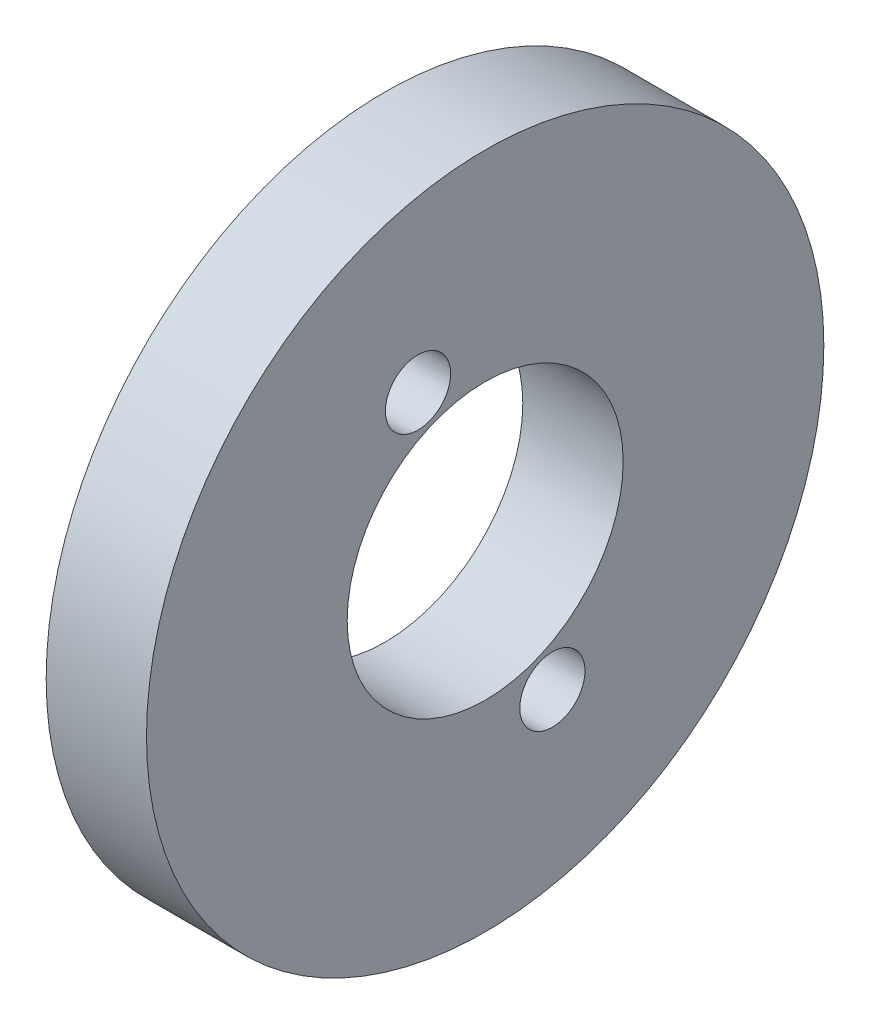
ISO-10303-21;
HEADER;
FILE_DESCRIPTION(('STEP AP214'),'2;1');
FILE_NAME('part.step','',(''),(''),'','','');
FILE_SCHEMA(('AUTOMOTIVE_DESIGN { 1 0 10303 214 1 1 1 1 }'));
ENDSEC;
DATA;
#1=APPLICATION_CONTEXT('core data for automotive mechanical design processes');
#2=APPLICATION_PROTOCOL_DEFINITION('international standard','automotive_design',2000,#1);
#3=PRODUCT_CONTEXT('',#1,'mechanical');
#4=PRODUCT('Part','Part','',(#3));
#5=PRODUCT_RELATED_PRODUCT_CATEGORY('part','',(#4));
#6=PRODUCT_DEFINITION_FORMATION('','',#4);
#7=PRODUCT_DEFINITION_CONTEXT('part definition',#1,'design');
#8=PRODUCT_DEFINITION('design','',#6,#7);
#9=PRODUCT_DEFINITION_SHAPE('','',#8);
#10=(LENGTH_UNIT() NAMED_UNIT(*) SI_UNIT(.MILLI.,.METRE.));
#11=(NAMED_UNIT(*) PLANE_ANGLE_UNIT() SI_UNIT($,.RADIAN.));
#12=(NAMED_UNIT(*) SI_UNIT($,.STERADIAN.) SOLID_ANGLE_UNIT());
#13=UNCERTAINTY_MEASURE_WITH_UNIT(LENGTH_MEASURE(1.E-05),#10,'distance_accuracy_value','');
#14=(GEOMETRIC_REPRESENTATION_CONTEXT(3) GLOBAL_UNCERTAINTY_ASSIGNED_CONTEXT((#13)) GLOBAL_UNIT_ASSIGNED_CONTEXT((#10,
#11,#12)) REPRESENTATION_CONTEXT('',''));
#15=CARTESIAN_POINT('',(0.,0.,0.));
#16=DIRECTION('',(0.,0.,1.));
#17=DIRECTION('',(1.,0.,0.));
#18=AXIS2_PLACEMENT_3D('',#15,#16,#17);
#19=CARTESIAN_POINT('',(135.7,27.,0.));
#20=DIRECTION('',(1.,0.,0.));
#21=DIRECTION('',(0.,0.,-1.));
#22=AXIS2_PLACEMENT_3D('',#19,#20,#21);
#23=PLANE('',#22);
#24=CARTESIAN_POINT('',(135.7,12.934313455158,5.35756805311126));
#25=DIRECTION('',(1.,0.,0.));
#26=DIRECTION('',(0.,0.,-1.));
#27=AXIS2_PLACEMENT_3D('',#24,#25,#26);
#28=CIRCLE('',#27,2.6);
#29=CARTESIAN_POINT('',(135.7,12.934313455158,2.75756805311126));
#30=VERTEX_POINT('',#29);
#31=EDGE_CURVE('E60',#30,#30,#28,.F.);
#32=ORIENTED_EDGE('',*,*,#31,.F.);
#33=EDGE_LOOP('',(#32));
#34=FACE_BOUND('',#33,.T.);
#35=CARTESIAN_POINT('',(135.7,-12.934313455158,-5.35756805311126));
#36=DIRECTION('',(1.,0.,0.));
#37=DIRECTION('',(0.,0.,-1.));
#38=AXIS2_PLACEMENT_3D('',#35,#36,#37);
#39=CIRCLE('',#38,2.6);
#40=CARTESIAN_POINT('',(135.7,-12.934313455158,-7.95756805311126));
#41=VERTEX_POINT('',#40);
#42=EDGE_CURVE('E64',#41,#41,#39,.F.);
#43=ORIENTED_EDGE('',*,*,#42,.F.);
#44=EDGE_LOOP('',(#43));
#45=FACE_BOUND('',#44,.T.);
#46=CARTESIAN_POINT('',(135.7,0.,0.));
#47=DIRECTION('',(-1.,0.,0.));
#48=DIRECTION('',(0.,0.,1.));
#49=AXIS2_PLACEMENT_3D('',#46,#47,#48);
#50=CIRCLE('',#49,11.);
#51=CARTESIAN_POINT('',(135.7,0.,11.));
#52=VERTEX_POINT('',#51);
#53=EDGE_CURVE('E10',#52,#52,#50,.T.);
#54=ORIENTED_EDGE('',*,*,#53,.F.);
#55=EDGE_LOOP('',(#54));
#56=FACE_BOUND('',#55,.T.);
#57=CARTESIAN_POINT('',(135.7,0.,0.));
#58=DIRECTION('',(-1.,0.,0.));
#59=DIRECTION('',(0.,0.,1.));
#60=AXIS2_PLACEMENT_3D('',#57,#58,#59);
#61=CIRCLE('',#60,27.);
#62=CARTESIAN_POINT('',(135.7,0.,27.));
#63=VERTEX_POINT('',#62);
#64=EDGE_CURVE('E54',#63,#63,#61,.T.);
#65=ORIENTED_EDGE('',*,*,#64,.T.);
#66=EDGE_LOOP('',(#65));
#67=FACE_BOUND('',#66,.T.);
#68=ADVANCED_FACE('F37',(#34,#45,#56,#67),#23,.F.);
#69=CARTESIAN_POINT('',(-110.,0.,0.));
#70=DIRECTION('',(-1.,0.,0.));
#71=DIRECTION('',(0.,0.,1.));
#72=AXIS2_PLACEMENT_3D('',#69,#70,#71);
#73=CYLINDRICAL_SURFACE('',#72,11.);
#74=CARTESIAN_POINT('',(143.7,0.,0.));
#75=DIRECTION('',(-1.,0.,0.));
#76=DIRECTION('',(0.,0.,1.));
#77=AXIS2_PLACEMENT_3D('',#74,#75,#76);
#78=CIRCLE('',#77,11.);
#79=CARTESIAN_POINT('',(143.7,0.,11.));
#80=VERTEX_POINT('',#79);
#81=EDGE_CURVE('E44',#80,#80,#78,.T.);
#82=ORIENTED_EDGE('',*,*,#81,.F.);
#83=EDGE_LOOP('',(#82));
#84=FACE_BOUND('',#83,.T.);
#85=ORIENTED_EDGE('',*,*,#53,.T.);
#86=EDGE_LOOP('',(#85));
#87=FACE_BOUND('',#86,.T.);
#88=ADVANCED_FACE('F84',(#84,#87),#73,.F.);
#89=CARTESIAN_POINT('',(143.7,11.,0.));
#90=DIRECTION('',(-1.,0.,0.));
#91=DIRECTION('',(0.,0.,1.));
#92=AXIS2_PLACEMENT_3D('',#89,#90,#91);
#93=PLANE('',#92);
#94=CARTESIAN_POINT('',(143.7,12.934313455158,5.35756805311126));
#95=DIRECTION('',(1.,0.,0.));
#96=DIRECTION('',(0.,0.,-1.));
#97=AXIS2_PLACEMENT_3D('',#94,#95,#96);
#98=CIRCLE('',#97,2.6);
#99=CARTESIAN_POINT('',(143.7,12.934313455158,2.75756805311126));
#100=VERTEX_POINT('',#99);
#101=EDGE_CURVE('E68',#100,#100,#98,.T.);
#102=ORIENTED_EDGE('',*,*,#101,.F.);
#103=EDGE_LOOP('',(#102));
#104=FACE_BOUND('',#103,.T.);
#105=CARTESIAN_POINT('',(143.7,-12.934313455158,-5.35756805311126));
#106=DIRECTION('',(1.,0.,0.));
#107=DIRECTION('',(0.,0.,-1.));
#108=AXIS2_PLACEMENT_3D('',#105,#106,#107);
#109=CIRCLE('',#108,2.6);
#110=CARTESIAN_POINT('',(143.7,-12.934313455158,-7.95756805311126));
#111=VERTEX_POINT('',#110);
#112=EDGE_CURVE('E69',#111,#111,#109,.T.);
#113=ORIENTED_EDGE('',*,*,#112,.F.);
#114=EDGE_LOOP('',(#113));
#115=FACE_BOUND('',#114,.T.);
#116=CARTESIAN_POINT('',(143.7,0.,0.));
#117=DIRECTION('',(-1.,0.,0.));
#118=DIRECTION('',(0.,0.,1.));
#119=AXIS2_PLACEMENT_3D('',#116,#117,#118);
#120=CIRCLE('',#119,27.);
#121=CARTESIAN_POINT('',(143.7,0.,27.));
#122=VERTEX_POINT('',#121);
#123=EDGE_CURVE('E49',#122,#122,#120,.T.);
#124=ORIENTED_EDGE('',*,*,#123,.F.);
#125=EDGE_LOOP('',(#124));
#126=FACE_BOUND('',#125,.T.);
#127=ORIENTED_EDGE('',*,*,#81,.T.);
#128=EDGE_LOOP('',(#127));
#129=FACE_BOUND('',#128,.T.);
#130=ADVANCED_FACE('F80',(#104,#115,#126,#129),#93,.F.);
#131=CARTESIAN_POINT('',(-110.,0.,0.));
#132=DIRECTION('',(-1.,0.,0.));
#133=DIRECTION('',(0.,0.,1.));
#134=AXIS2_PLACEMENT_3D('',#131,#132,#133);
#135=CYLINDRICAL_SURFACE('',#134,27.);
#136=ORIENTED_EDGE('',*,*,#64,.F.);
#137=EDGE_LOOP('',(#136));
#138=FACE_BOUND('',#137,.T.);
#139=ORIENTED_EDGE('',*,*,#123,.T.);
#140=EDGE_LOOP('',(#139));
#141=FACE_BOUND('',#140,.T.);
#142=ADVANCED_FACE('F83',(#138,#141),#135,.T.);
#143=CARTESIAN_POINT('',(135.7,-12.934313455158,-5.35756805311126));
#144=DIRECTION('',(-1.,0.,0.));
#145=DIRECTION('',(0.,0.,1.));
#146=AXIS2_PLACEMENT_3D('',#143,#144,#145);
#147=CYLINDRICAL_SURFACE('',#146,2.6);
#148=ORIENTED_EDGE('',*,*,#112,.T.);
#149=EDGE_LOOP('',(#148));
#150=FACE_BOUND('',#149,.T.);
#151=ORIENTED_EDGE('',*,*,#42,.T.);
#152=EDGE_LOOP('',(#151));
#153=FACE_BOUND('',#152,.T.);
#154=ADVANCED_FACE('F91',(#150,#153),#147,.F.);
#155=CARTESIAN_POINT('',(135.7,12.934313455158,5.35756805311126));
#156=DIRECTION('',(-1.,0.,0.));
#157=DIRECTION('',(0.,0.,1.));
#158=AXIS2_PLACEMENT_3D('',#155,#156,#157);
#159=CYLINDRICAL_SURFACE('',#158,2.6);
#160=ORIENTED_EDGE('',*,*,#101,.T.);
#161=EDGE_LOOP('',(#160));
#162=FACE_BOUND('',#161,.T.);
#163=ORIENTED_EDGE('',*,*,#31,.T.);
#164=EDGE_LOOP('',(#163));
#165=FACE_BOUND('',#164,.T.);
#166=ADVANCED_FACE('F77',(#162,#165),#159,.F.);
#167=CLOSED_SHELL('',(#68,#88,#130,#142,#154,#166));
#168=MANIFOLD_SOLID_BREP('B2',#167);
#169=ADVANCED_BREP_SHAPE_REPRESENTATION('',(#18,#168),#14);
#170=SHAPE_DEFINITION_REPRESENTATION(#9,#169);
ENDSEC;
END-ISO-10303-21;
